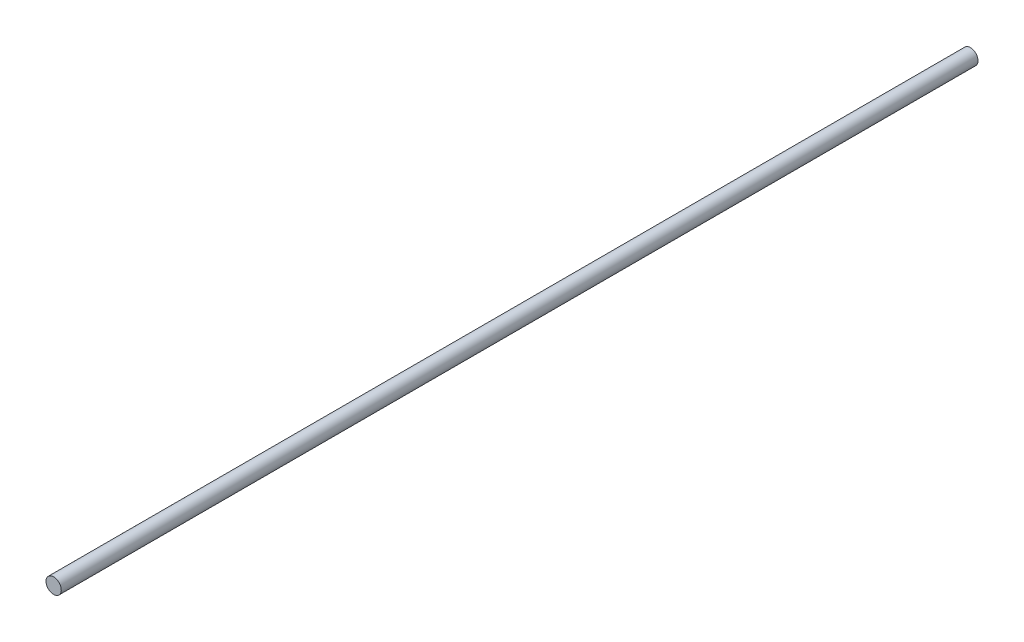
ISO-10303-21;
HEADER;
FILE_DESCRIPTION(('STEP AP214'),'2;1');
FILE_NAME('part.step','',(''),(''),'','','');
FILE_SCHEMA(('AUTOMOTIVE_DESIGN { 1 0 10303 214 1 1 1 1 }'));
ENDSEC;
DATA;
#1=APPLICATION_CONTEXT('core data for automotive mechanical design processes');
#2=APPLICATION_PROTOCOL_DEFINITION('international standard','automotive_design',2000,#1);
#3=PRODUCT_CONTEXT('',#1,'mechanical');
#4=PRODUCT('Part','Part','',(#3));
#5=PRODUCT_RELATED_PRODUCT_CATEGORY('part','',(#4));
#6=PRODUCT_DEFINITION_FORMATION('','',#4);
#7=PRODUCT_DEFINITION_CONTEXT('part definition',#1,'design');
#8=PRODUCT_DEFINITION('design','',#6,#7);
#9=PRODUCT_DEFINITION_SHAPE('','',#8);
#10=(LENGTH_UNIT() NAMED_UNIT(*) SI_UNIT(.MILLI.,.METRE.));
#11=(NAMED_UNIT(*) PLANE_ANGLE_UNIT() SI_UNIT($,.RADIAN.));
#12=(NAMED_UNIT(*) SI_UNIT($,.STERADIAN.) SOLID_ANGLE_UNIT());
#13=UNCERTAINTY_MEASURE_WITH_UNIT(LENGTH_MEASURE(1.E-05),#10,'distance_accuracy_value','');
#14=(GEOMETRIC_REPRESENTATION_CONTEXT(3) GLOBAL_UNCERTAINTY_ASSIGNED_CONTEXT((#13)) GLOBAL_UNIT_ASSIGNED_CONTEXT((#10,
#11,#12)) REPRESENTATION_CONTEXT('',''));
#15=CARTESIAN_POINT('',(0.,0.,0.));
#16=DIRECTION('',(0.,0.,1.));
#17=DIRECTION('',(1.,0.,0.));
#18=AXIS2_PLACEMENT_3D('',#15,#16,#17);
#19=CARTESIAN_POINT('',(0.,0.,1143.));
#20=DIRECTION('',(0.,0.,-1.));
#21=DIRECTION('',(-1.,0.,0.));
#22=AXIS2_PLACEMENT_3D('',#19,#20,#21);
#23=CYLINDRICAL_SURFACE('',#22,9.525);
#24=CARTESIAN_POINT('',(0.,0.,1143.));
#25=DIRECTION('',(0.,0.,1.));
#26=DIRECTION('',(1.,0.,0.));
#27=AXIS2_PLACEMENT_3D('',#24,#25,#26);
#28=CIRCLE('',#27,9.525);
#29=CARTESIAN_POINT('',(9.525,0.,1143.));
#30=VERTEX_POINT('',#29);
#31=EDGE_CURVE('E12',#30,#30,#28,.T.);
#32=ORIENTED_EDGE('',*,*,#31,.F.);
#33=EDGE_LOOP('',(#32));
#34=FACE_BOUND('',#33,.T.);
#35=CARTESIAN_POINT('',(0.,0.,0.));
#36=DIRECTION('',(0.,0.,1.));
#37=DIRECTION('',(1.,0.,0.));
#38=AXIS2_PLACEMENT_3D('',#35,#36,#37);
#39=CIRCLE('',#38,9.525);
#40=CARTESIAN_POINT('',(9.525,0.,0.));
#41=VERTEX_POINT('',#40);
#42=EDGE_CURVE('E45',#41,#41,#39,.T.);
#43=ORIENTED_EDGE('',*,*,#42,.T.);
#44=EDGE_LOOP('',(#43));
#45=FACE_BOUND('',#44,.T.);
#46=ADVANCED_FACE('F42',(#34,#45),#23,.T.);
#47=CARTESIAN_POINT('',(0.,0.,1143.));
#48=DIRECTION('',(0.,0.,1.));
#49=DIRECTION('',(1.,0.,0.));
#50=AXIS2_PLACEMENT_3D('',#47,#48,#49);
#51=PLANE('',#50);
#52=ORIENTED_EDGE('',*,*,#31,.T.);
#53=EDGE_LOOP('',(#52));
#54=FACE_BOUND('',#53,.T.);
#55=ADVANCED_FACE('F57',(#54),#51,.T.);
#56=CARTESIAN_POINT('',(0.,0.,0.));
#57=DIRECTION('',(0.,0.,1.));
#58=DIRECTION('',(1.,0.,0.));
#59=AXIS2_PLACEMENT_3D('',#56,#57,#58);
#60=PLANE('',#59);
#61=ORIENTED_EDGE('',*,*,#42,.F.);
#62=EDGE_LOOP('',(#61));
#63=FACE_BOUND('',#62,.T.);
#64=ADVANCED_FACE('F55',(#63),#60,.F.);
#65=CLOSED_SHELL('',(#46,#55,#64));
#66=MANIFOLD_SOLID_BREP('B2',#65);
#67=ADVANCED_BREP_SHAPE_REPRESENTATION('',(#18,#66),#14);
#68=SHAPE_DEFINITION_REPRESENTATION(#9,#67);
ENDSEC;
END-ISO-10303-21;
